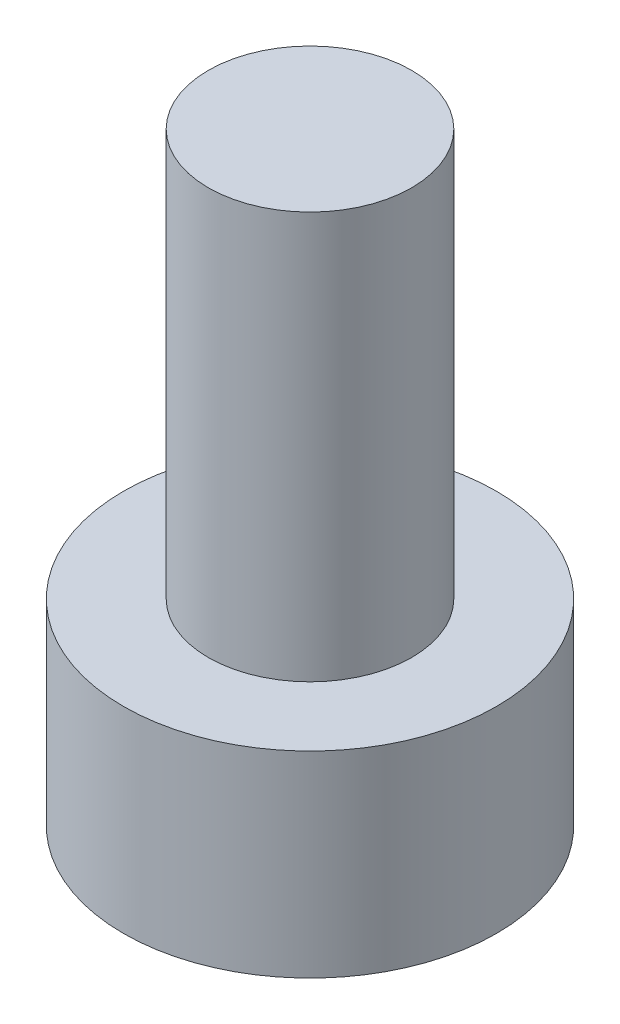
ISO-10303-21;
HEADER;
FILE_DESCRIPTION(('STEP AP214'),'2;1');
FILE_NAME('part.step','',(''),(''),'','','');
FILE_SCHEMA(('AUTOMOTIVE_DESIGN { 1 0 10303 214 1 1 1 1 }'));
ENDSEC;
DATA;
#1=APPLICATION_CONTEXT('core data for automotive mechanical design processes');
#2=APPLICATION_PROTOCOL_DEFINITION('international standard','automotive_design',2000,#1);
#3=PRODUCT_CONTEXT('',#1,'mechanical');
#4=PRODUCT('Part','Part','',(#3));
#5=PRODUCT_RELATED_PRODUCT_CATEGORY('part','',(#4));
#6=PRODUCT_DEFINITION_FORMATION('','',#4);
#7=PRODUCT_DEFINITION_CONTEXT('part definition',#1,'design');
#8=PRODUCT_DEFINITION('design','',#6,#7);
#9=PRODUCT_DEFINITION_SHAPE('','',#8);
#10=(LENGTH_UNIT() NAMED_UNIT(*) SI_UNIT(.MILLI.,.METRE.));
#11=(NAMED_UNIT(*) PLANE_ANGLE_UNIT() SI_UNIT($,.RADIAN.));
#12=(NAMED_UNIT(*) SI_UNIT($,.STERADIAN.) SOLID_ANGLE_UNIT());
#13=UNCERTAINTY_MEASURE_WITH_UNIT(LENGTH_MEASURE(1.E-05),#10,'distance_accuracy_value','');
#14=(GEOMETRIC_REPRESENTATION_CONTEXT(3) GLOBAL_UNCERTAINTY_ASSIGNED_CONTEXT((#13)) GLOBAL_UNIT_ASSIGNED_CONTEXT((#10,
#11,#12)) REPRESENTATION_CONTEXT('',''));
#15=CARTESIAN_POINT('',(0.,0.,0.));
#16=DIRECTION('',(0.,0.,1.));
#17=DIRECTION('',(1.,0.,0.));
#18=AXIS2_PLACEMENT_3D('',#15,#16,#17);
#19=CARTESIAN_POINT('',(0.,6.,0.));
#20=DIRECTION('',(0.,-1.,0.));
#21=DIRECTION('',(0.,0.,-1.));
#22=AXIS2_PLACEMENT_3D('',#19,#20,#21);
#23=CYLINDRICAL_SURFACE('',#22,1.5);
#24=CARTESIAN_POINT('',(0.,6.,0.));
#25=DIRECTION('',(0.,1.,0.));
#26=DIRECTION('',(0.,0.,1.));
#27=AXIS2_PLACEMENT_3D('',#24,#25,#26);
#28=CIRCLE('',#27,1.5);
#29=CARTESIAN_POINT('',(0.,6.,1.5));
#30=VERTEX_POINT('',#29);
#31=EDGE_CURVE('E11',#30,#30,#28,.T.);
#32=ORIENTED_EDGE('',*,*,#31,.F.);
#33=EDGE_LOOP('',(#32));
#34=FACE_BOUND('',#33,.T.);
#35=CARTESIAN_POINT('',(0.,0.,0.));
#36=DIRECTION('',(0.,1.,0.));
#37=DIRECTION('',(0.,0.,1.));
#38=AXIS2_PLACEMENT_3D('',#35,#36,#37);
#39=CIRCLE('',#38,1.5);
#40=CARTESIAN_POINT('',(0.,0.,1.5));
#41=VERTEX_POINT('',#40);
#42=EDGE_CURVE('E44',#41,#41,#39,.T.);
#43=ORIENTED_EDGE('',*,*,#42,.T.);
#44=EDGE_LOOP('',(#43));
#45=FACE_BOUND('',#44,.T.);
#46=ADVANCED_FACE('F41',(#34,#45),#23,.T.);
#47=CARTESIAN_POINT('',(0.,6.,0.));
#48=DIRECTION('',(0.,1.,0.));
#49=DIRECTION('',(0.,0.,1.));
#50=AXIS2_PLACEMENT_3D('',#47,#48,#49);
#51=PLANE('',#50);
#52=ORIENTED_EDGE('',*,*,#31,.T.);
#53=EDGE_LOOP('',(#52));
#54=FACE_BOUND('',#53,.T.);
#55=ADVANCED_FACE('F174',(#54),#51,.T.);
#56=CARTESIAN_POINT('',(0.,-2.9,0.));
#57=DIRECTION('',(0.,1.,0.));
#58=DIRECTION('',(0.,0.,1.));
#59=AXIS2_PLACEMENT_3D('',#56,#57,#58);
#60=CYLINDRICAL_SURFACE('',#59,2.75);
#61=CARTESIAN_POINT('',(0.,-2.9,0.));
#62=DIRECTION('',(0.,-1.,0.));
#63=DIRECTION('',(0.,0.,-1.));
#64=AXIS2_PLACEMENT_3D('',#61,#62,#63);
#65=CIRCLE('',#64,2.75);
#66=CARTESIAN_POINT('',(0.,-2.9,-2.75));
#67=VERTEX_POINT('',#66);
#68=EDGE_CURVE('E148',#67,#67,#65,.T.);
#69=ORIENTED_EDGE('',*,*,#68,.F.);
#70=EDGE_LOOP('',(#69));
#71=FACE_BOUND('',#70,.T.);
#72=CARTESIAN_POINT('',(0.,0.,0.));
#73=DIRECTION('',(0.,-1.,0.));
#74=DIRECTION('',(0.,0.,-1.));
#75=AXIS2_PLACEMENT_3D('',#72,#73,#74);
#76=CIRCLE('',#75,2.75);
#77=CARTESIAN_POINT('',(0.,0.,-2.75));
#78=VERTEX_POINT('',#77);
#79=EDGE_CURVE('E142',#78,#78,#76,.T.);
#80=ORIENTED_EDGE('',*,*,#79,.T.);
#81=EDGE_LOOP('',(#80));
#82=FACE_BOUND('',#81,.T.);
#83=ADVANCED_FACE('F154',(#71,#82),#60,.T.);
#84=CARTESIAN_POINT('',(0.,-2.9,0.));
#85=DIRECTION('',(0.,-1.,0.));
#86=DIRECTION('',(0.,0.,-1.));
#87=AXIS2_PLACEMENT_3D('',#84,#85,#86);
#88=PLANE('',#87);
#89=DIRECTION('',(0.,0.,1.));
#90=VECTOR('',#89,1.);
#91=CARTESIAN_POINT('',(1.25,-2.9,-0.721687836487033));
#92=LINE('',#91,#90);
#93=CARTESIAN_POINT('',(1.25,-2.9,-0.721687836487033));
#94=VERTEX_POINT('',#93);
#95=CARTESIAN_POINT('',(1.25,-2.9,0.721687836487032));
#96=VERTEX_POINT('',#95);
#97=EDGE_CURVE('E55',#94,#96,#92,.T.);
#98=ORIENTED_EDGE('',*,*,#97,.F.);
#99=DIRECTION('',(0.866025403784439,0.,0.5));
#100=VECTOR('',#99,1.);
#101=CARTESIAN_POINT('',(0.,-2.9,-1.44337567297406));
#102=LINE('',#101,#100);
#103=CARTESIAN_POINT('',(0.,-2.9,-1.44337567297406));
#104=VERTEX_POINT('',#103);
#105=EDGE_CURVE('E138',#104,#94,#102,.T.);
#106=ORIENTED_EDGE('',*,*,#105,.F.);
#107=DIRECTION('',(0.866025403784438,0.,-0.5));
#108=VECTOR('',#107,1.);
#109=CARTESIAN_POINT('',(-1.25,-2.9,-0.721687836487032));
#110=LINE('',#109,#108);
#111=CARTESIAN_POINT('',(-1.25,-2.9,-0.721687836487032));
#112=VERTEX_POINT('',#111);
#113=EDGE_CURVE('E136',#112,#104,#110,.T.);
#114=ORIENTED_EDGE('',*,*,#113,.F.);
#115=DIRECTION('',(0.,0.,-1.));
#116=VECTOR('',#115,1.);
#117=CARTESIAN_POINT('',(-1.25,-2.9,0.721687836487032));
#118=LINE('',#117,#116);
#119=CARTESIAN_POINT('',(-1.25,-2.9,0.721687836487032));
#120=VERTEX_POINT('',#119);
#121=EDGE_CURVE('E103',#120,#112,#118,.T.);
#122=ORIENTED_EDGE('',*,*,#121,.F.);
#123=DIRECTION('',(-0.866025403784439,0.,-0.5));
#124=VECTOR('',#123,1.);
#125=CARTESIAN_POINT('',(0.,-2.9,1.44337567297406));
#126=LINE('',#125,#124);
#127=CARTESIAN_POINT('',(0.,-2.9,1.44337567297406));
#128=VERTEX_POINT('',#127);
#129=EDGE_CURVE('E132',#128,#120,#126,.T.);
#130=ORIENTED_EDGE('',*,*,#129,.F.);
#131=DIRECTION('',(-0.866025403784439,0.,0.5));
#132=VECTOR('',#131,1.);
#133=CARTESIAN_POINT('',(1.25,-2.9,0.721687836487032));
#134=LINE('',#133,#132);
#135=EDGE_CURVE('E129',#96,#128,#134,.T.);
#136=ORIENTED_EDGE('',*,*,#135,.F.);
#137=EDGE_LOOP('',(#98,#106,#114,#122,#130,#136));
#138=FACE_BOUND('',#137,.T.);
#139=ORIENTED_EDGE('',*,*,#68,.T.);
#140=EDGE_LOOP('',(#139));
#141=FACE_BOUND('',#140,.T.);
#142=ADVANCED_FACE('F159',(#138,#141),#88,.T.);
#143=CARTESIAN_POINT('',(0.,0.,0.));
#144=DIRECTION('',(0.,-1.,0.));
#145=DIRECTION('',(0.,0.,-1.));
#146=AXIS2_PLACEMENT_3D('',#143,#144,#145);
#147=PLANE('',#146);
#148=ORIENTED_EDGE('',*,*,#42,.F.);
#149=EDGE_LOOP('',(#148));
#150=FACE_BOUND('',#149,.T.);
#151=ORIENTED_EDGE('',*,*,#79,.F.);
#152=EDGE_LOOP('',(#151));
#153=FACE_BOUND('',#152,.T.);
#154=ADVANCED_FACE('F156',(#150,#153),#147,.F.);
#155=CARTESIAN_POINT('',(1.25,-1.4,-0.721687836487033));
#156=DIRECTION('',(1.,0.,0.));
#157=DIRECTION('',(0.,0.,-1.));
#158=AXIS2_PLACEMENT_3D('',#155,#156,#157);
#159=PLANE('',#158);
#160=ORIENTED_EDGE('',*,*,#97,.T.);
#161=DIRECTION('',(0.,-1.,0.));
#162=VECTOR('',#161,1.);
#163=CARTESIAN_POINT('',(1.25,-1.4,0.721687836487032));
#164=LINE('',#163,#162);
#165=CARTESIAN_POINT('',(1.25,-1.4,0.721687836487032));
#166=VERTEX_POINT('',#165);
#167=EDGE_CURVE('E85',#166,#96,#164,.T.);
#168=ORIENTED_EDGE('',*,*,#167,.F.);
#169=DIRECTION('',(0.,0.,1.));
#170=VECTOR('',#169,1.);
#171=CARTESIAN_POINT('',(1.25,-1.4,-0.721687836487033));
#172=LINE('',#171,#170);
#173=CARTESIAN_POINT('',(1.25,-1.4,-0.721687836487033));
#174=VERTEX_POINT('',#173);
#175=EDGE_CURVE('E140',#174,#166,#172,.T.);
#176=ORIENTED_EDGE('',*,*,#175,.F.);
#177=DIRECTION('',(0.,-1.,0.));
#178=VECTOR('',#177,1.);
#179=CARTESIAN_POINT('',(1.25,-1.4,-0.721687836487033));
#180=LINE('',#179,#178);
#181=EDGE_CURVE('E63',#174,#94,#180,.T.);
#182=ORIENTED_EDGE('',*,*,#181,.T.);
#183=EDGE_LOOP('',(#160,#168,#176,#182));
#184=FACE_BOUND('',#183,.T.);
#185=ADVANCED_FACE('F158',(#184),#159,.F.);
#186=CARTESIAN_POINT('',(0.,-1.4,-1.44337567297406));
#187=DIRECTION('',(0.5,0.,-0.866025403784439));
#188=DIRECTION('',(-0.866025403784439,0.,-0.5));
#189=AXIS2_PLACEMENT_3D('',#186,#187,#188);
#190=PLANE('',#189);
#191=ORIENTED_EDGE('',*,*,#105,.T.);
#192=ORIENTED_EDGE('',*,*,#181,.F.);
#193=DIRECTION('',(0.866025403784439,0.,0.5));
#194=VECTOR('',#193,1.);
#195=CARTESIAN_POINT('',(0.,-1.4,-1.44337567297406));
#196=LINE('',#195,#194);
#197=CARTESIAN_POINT('',(0.,-1.4,-1.44337567297406));
#198=VERTEX_POINT('',#197);
#199=EDGE_CURVE('E115',#198,#174,#196,.T.);
#200=ORIENTED_EDGE('',*,*,#199,.F.);
#201=DIRECTION('',(0.,-1.,0.));
#202=VECTOR('',#201,1.);
#203=CARTESIAN_POINT('',(0.,-1.4,-1.44337567297406));
#204=LINE('',#203,#202);
#205=EDGE_CURVE('E107',#198,#104,#204,.T.);
#206=ORIENTED_EDGE('',*,*,#205,.T.);
#207=EDGE_LOOP('',(#191,#192,#200,#206));
#208=FACE_BOUND('',#207,.T.);
#209=ADVANCED_FACE('F167',(#208),#190,.F.);
#210=CARTESIAN_POINT('',(-1.25,-1.4,-0.721687836487032));
#211=DIRECTION('',(-0.5,0.,-0.866025403784439));
#212=DIRECTION('',(-0.866025403784439,0.,0.5));
#213=AXIS2_PLACEMENT_3D('',#210,#211,#212);
#214=PLANE('',#213);
#215=ORIENTED_EDGE('',*,*,#113,.T.);
#216=ORIENTED_EDGE('',*,*,#205,.F.);
#217=DIRECTION('',(0.866025403784438,0.,-0.5));
#218=VECTOR('',#217,1.);
#219=CARTESIAN_POINT('',(-1.25,-1.4,-0.721687836487032));
#220=LINE('',#219,#218);
#221=CARTESIAN_POINT('',(-1.25,-1.4,-0.721687836487032));
#222=VERTEX_POINT('',#221);
#223=EDGE_CURVE('E111',#222,#198,#220,.T.);
#224=ORIENTED_EDGE('',*,*,#223,.F.);
#225=DIRECTION('',(0.,-1.,0.));
#226=VECTOR('',#225,1.);
#227=CARTESIAN_POINT('',(-1.25,-1.4,-0.721687836487032));
#228=LINE('',#227,#226);
#229=EDGE_CURVE('E96',#222,#112,#228,.T.);
#230=ORIENTED_EDGE('',*,*,#229,.T.);
#231=EDGE_LOOP('',(#215,#216,#224,#230));
#232=FACE_BOUND('',#231,.T.);
#233=ADVANCED_FACE('F112',(#232),#214,.F.);
#234=CARTESIAN_POINT('',(-1.25,-1.4,0.721687836487032));
#235=DIRECTION('',(-1.,0.,0.));
#236=DIRECTION('',(0.,0.,1.));
#237=AXIS2_PLACEMENT_3D('',#234,#235,#236);
#238=PLANE('',#237);
#239=ORIENTED_EDGE('',*,*,#121,.T.);
#240=ORIENTED_EDGE('',*,*,#229,.F.);
#241=DIRECTION('',(0.,0.,-1.));
#242=VECTOR('',#241,1.);
#243=CARTESIAN_POINT('',(-1.25,-1.4,0.721687836487032));
#244=LINE('',#243,#242);
#245=CARTESIAN_POINT('',(-1.25,-1.4,0.721687836487032));
#246=VERTEX_POINT('',#245);
#247=EDGE_CURVE('E100',#246,#222,#244,.T.);
#248=ORIENTED_EDGE('',*,*,#247,.F.);
#249=DIRECTION('',(0.,-1.,0.));
#250=VECTOR('',#249,1.);
#251=CARTESIAN_POINT('',(-1.25,-1.4,0.721687836487032));
#252=LINE('',#251,#250);
#253=EDGE_CURVE('E108',#246,#120,#252,.T.);
#254=ORIENTED_EDGE('',*,*,#253,.T.);
#255=EDGE_LOOP('',(#239,#240,#248,#254));
#256=FACE_BOUND('',#255,.T.);
#257=ADVANCED_FACE('F98',(#256),#238,.F.);
#258=CARTESIAN_POINT('',(0.,-1.4,1.44337567297406));
#259=DIRECTION('',(-0.5,0.,0.866025403784439));
#260=DIRECTION('',(0.866025403784439,0.,0.5));
#261=AXIS2_PLACEMENT_3D('',#258,#259,#260);
#262=PLANE('',#261);
#263=ORIENTED_EDGE('',*,*,#129,.T.);
#264=ORIENTED_EDGE('',*,*,#253,.F.);
#265=DIRECTION('',(-0.866025403784439,0.,-0.5));
#266=VECTOR('',#265,1.);
#267=CARTESIAN_POINT('',(0.,-1.4,1.44337567297406));
#268=LINE('',#267,#266);
#269=CARTESIAN_POINT('',(0.,-1.4,1.44337567297406));
#270=VERTEX_POINT('',#269);
#271=EDGE_CURVE('E121',#270,#246,#268,.T.);
#272=ORIENTED_EDGE('',*,*,#271,.F.);
#273=DIRECTION('',(0.,-1.,0.));
#274=VECTOR('',#273,1.);
#275=CARTESIAN_POINT('',(0.,-1.4,1.44337567297406));
#276=LINE('',#275,#274);
#277=EDGE_CURVE('E145',#270,#128,#276,.T.);
#278=ORIENTED_EDGE('',*,*,#277,.T.);
#279=EDGE_LOOP('',(#263,#264,#272,#278));
#280=FACE_BOUND('',#279,.T.);
#281=ADVANCED_FACE('F235',(#280),#262,.F.);
#282=CARTESIAN_POINT('',(1.25,-1.4,0.721687836487032));
#283=DIRECTION('',(0.5,0.,0.866025403784439));
#284=DIRECTION('',(0.866025403784439,0.,-0.5));
#285=AXIS2_PLACEMENT_3D('',#282,#283,#284);
#286=PLANE('',#285);
#287=ORIENTED_EDGE('',*,*,#135,.T.);
#288=ORIENTED_EDGE('',*,*,#277,.F.);
#289=DIRECTION('',(-0.866025403784439,0.,0.5));
#290=VECTOR('',#289,1.);
#291=CARTESIAN_POINT('',(1.25,-1.4,0.721687836487032));
#292=LINE('',#291,#290);
#293=EDGE_CURVE('E123',#166,#270,#292,.T.);
#294=ORIENTED_EDGE('',*,*,#293,.F.);
#295=ORIENTED_EDGE('',*,*,#167,.T.);
#296=EDGE_LOOP('',(#287,#288,#294,#295));
#297=FACE_BOUND('',#296,.T.);
#298=ADVANCED_FACE('F244',(#297),#286,.F.);
#299=CARTESIAN_POINT('',(0.,-1.4,0.));
#300=DIRECTION('',(0.,-1.,0.));
#301=DIRECTION('',(0.,0.,-1.));
#302=AXIS2_PLACEMENT_3D('',#299,#300,#301);
#303=PLANE('',#302);
#304=ORIENTED_EDGE('',*,*,#175,.T.);
#305=ORIENTED_EDGE('',*,*,#293,.T.);
#306=ORIENTED_EDGE('',*,*,#271,.T.);
#307=ORIENTED_EDGE('',*,*,#247,.T.);
#308=ORIENTED_EDGE('',*,*,#223,.T.);
#309=ORIENTED_EDGE('',*,*,#199,.T.);
#310=EDGE_LOOP('',(#304,#305,#306,#307,#308,#309));
#311=FACE_BOUND('',#310,.T.);
#312=ADVANCED_FACE('F118',(#311),#303,.T.);
#313=CLOSED_SHELL('',(#46,#55,#83,#142,#154,#185,#209,#233,#257,#281,#298,#312));
#314=MANIFOLD_SOLID_BREP('B2',#313);
#315=ADVANCED_BREP_SHAPE_REPRESENTATION('',(#18,#314),#14);
#316=SHAPE_DEFINITION_REPRESENTATION(#9,#315);
ENDSEC;
END-ISO-10303-21;
